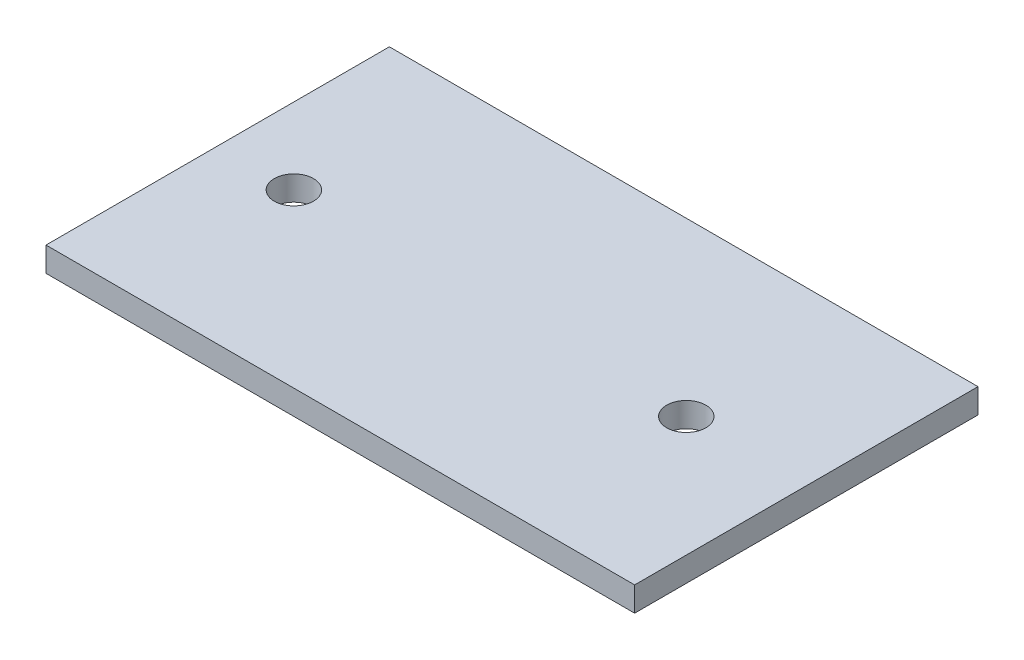
ISO-10303-21;
HEADER;
FILE_DESCRIPTION(('STEP AP214'),'2;1');
FILE_NAME('part.step','',(''),(''),'','','');
FILE_SCHEMA(('AUTOMOTIVE_DESIGN { 1 0 10303 214 1 1 1 1 }'));
ENDSEC;
DATA;
#1=APPLICATION_CONTEXT('core data for automotive mechanical design processes');
#2=APPLICATION_PROTOCOL_DEFINITION('international standard','automotive_design',2000,#1);
#3=PRODUCT_CONTEXT('',#1,'mechanical');
#4=PRODUCT('Part','Part','',(#3));
#5=PRODUCT_RELATED_PRODUCT_CATEGORY('part','',(#4));
#6=PRODUCT_DEFINITION_FORMATION('','',#4);
#7=PRODUCT_DEFINITION_CONTEXT('part definition',#1,'design');
#8=PRODUCT_DEFINITION('design','',#6,#7);
#9=PRODUCT_DEFINITION_SHAPE('','',#8);
#10=(LENGTH_UNIT() NAMED_UNIT(*) SI_UNIT(.MILLI.,.METRE.));
#11=(NAMED_UNIT(*) PLANE_ANGLE_UNIT() SI_UNIT($,.RADIAN.));
#12=(NAMED_UNIT(*) SI_UNIT($,.STERADIAN.) SOLID_ANGLE_UNIT());
#13=UNCERTAINTY_MEASURE_WITH_UNIT(LENGTH_MEASURE(1.E-05),#10,'distance_accuracy_value','');
#14=(GEOMETRIC_REPRESENTATION_CONTEXT(3) GLOBAL_UNCERTAINTY_ASSIGNED_CONTEXT((#13)) GLOBAL_UNIT_ASSIGNED_CONTEXT((#10,
#11,#12)) REPRESENTATION_CONTEXT('',''));
#15=CARTESIAN_POINT('',(0.,0.,0.));
#16=DIRECTION('',(0.,0.,1.));
#17=DIRECTION('',(1.,0.,0.));
#18=AXIS2_PLACEMENT_3D('',#15,#16,#17);
#19=CARTESIAN_POINT('',(0.,5.,0.));
#20=DIRECTION('',(0.,1.,0.));
#21=DIRECTION('',(0.,0.,1.));
#22=AXIS2_PLACEMENT_3D('',#19,#20,#21);
#23=PLANE('',#22);
#24=CARTESIAN_POINT('',(0.,5.,30.0341049386259));
#25=DIRECTION('',(0.,1.,0.));
#26=DIRECTION('',(0.,0.,1.));
#27=AXIS2_PLACEMENT_3D('',#24,#25,#26);
#28=CIRCLE('',#27,4.);
#29=CARTESIAN_POINT('',(0.,5.,34.0341049386259));
#30=VERTEX_POINT('',#29);
#31=EDGE_CURVE('E100',#30,#30,#28,.T.);
#32=ORIENTED_EDGE('',*,*,#31,.F.);
#33=EDGE_LOOP('',(#32));
#34=FACE_BOUND('',#33,.T.);
#35=DIRECTION('',(0.,0.,1.));
#36=VECTOR('',#35,1.);
#37=CARTESIAN_POINT('',(-15.5286393255011,5.,-4.96589506137411));
#38=LINE('',#37,#36);
#39=CARTESIAN_POINT('',(-15.5286393255011,5.,-4.96589506137411));
#40=VERTEX_POINT('',#39);
#41=CARTESIAN_POINT('',(-15.5286393255011,5.,65.0341049386259));
#42=VERTEX_POINT('',#41);
#43=EDGE_CURVE('E85',#40,#42,#38,.T.);
#44=ORIENTED_EDGE('',*,*,#43,.T.);
#45=DIRECTION('',(1.,0.,0.));
#46=VECTOR('',#45,1.);
#47=CARTESIAN_POINT('',(-15.5286393255011,5.,65.0341049386259));
#48=LINE('',#47,#46);
#49=CARTESIAN_POINT('',(104.471360674499,5.,65.0341049386259));
#50=VERTEX_POINT('',#49);
#51=EDGE_CURVE('E80',#42,#50,#48,.T.);
#52=ORIENTED_EDGE('',*,*,#51,.T.);
#53=DIRECTION('',(0.,0.,-1.));
#54=VECTOR('',#53,1.);
#55=CARTESIAN_POINT('',(104.471360674499,5.,-4.96589506137411));
#56=LINE('',#55,#54);
#57=CARTESIAN_POINT('',(104.471360674499,5.,-4.96589506137411));
#58=VERTEX_POINT('',#57);
#59=EDGE_CURVE('E83',#50,#58,#56,.T.);
#60=ORIENTED_EDGE('',*,*,#59,.T.);
#61=DIRECTION('',(-1.,0.,0.));
#62=VECTOR('',#61,1.);
#63=CARTESIAN_POINT('',(-15.5286393255011,5.,-4.96589506137411));
#64=LINE('',#63,#62);
#65=EDGE_CURVE('E50',#58,#40,#64,.T.);
#66=ORIENTED_EDGE('',*,*,#65,.T.);
#67=EDGE_LOOP('',(#44,#52,#60,#66));
#68=FACE_BOUND('',#67,.T.);
#69=CARTESIAN_POINT('',(80.,5.,30.0341049386259));
#70=DIRECTION('',(0.,1.,0.));
#71=DIRECTION('',(0.,0.,1.));
#72=AXIS2_PLACEMENT_3D('',#69,#70,#71);
#73=CIRCLE('',#72,4.00000000000001);
#74=CARTESIAN_POINT('',(80.,5.,34.0341049386259));
#75=VERTEX_POINT('',#74);
#76=EDGE_CURVE('E115',#75,#75,#73,.T.);
#77=ORIENTED_EDGE('',*,*,#76,.F.);
#78=EDGE_LOOP('',(#77));
#79=FACE_BOUND('',#78,.T.);
#80=ADVANCED_FACE('F33',(#34,#68,#79),#23,.T.);
#81=CARTESIAN_POINT('',(0.,0.,0.));
#82=DIRECTION('',(0.,1.,0.));
#83=DIRECTION('',(0.,0.,1.));
#84=AXIS2_PLACEMENT_3D('',#81,#82,#83);
#85=PLANE('',#84);
#86=DIRECTION('',(0.,0.,1.));
#87=VECTOR('',#86,1.);
#88=CARTESIAN_POINT('',(-15.5286393255011,0.,-4.96589506137411));
#89=LINE('',#88,#87);
#90=CARTESIAN_POINT('',(-15.5286393255011,0.,-4.96589506137411));
#91=VERTEX_POINT('',#90);
#92=CARTESIAN_POINT('',(-15.5286393255011,0.,65.0341049386259));
#93=VERTEX_POINT('',#92);
#94=EDGE_CURVE('E97',#91,#93,#89,.T.);
#95=ORIENTED_EDGE('',*,*,#94,.F.);
#96=DIRECTION('',(-1.,0.,0.));
#97=VECTOR('',#96,1.);
#98=CARTESIAN_POINT('',(-15.5286393255011,0.,-4.96589506137411));
#99=LINE('',#98,#97);
#100=CARTESIAN_POINT('',(104.471360674499,0.,-4.96589506137411));
#101=VERTEX_POINT('',#100);
#102=EDGE_CURVE('E73',#101,#91,#99,.T.);
#103=ORIENTED_EDGE('',*,*,#102,.F.);
#104=DIRECTION('',(0.,0.,-1.));
#105=VECTOR('',#104,1.);
#106=CARTESIAN_POINT('',(104.471360674499,0.,-4.96589506137411));
#107=LINE('',#106,#105);
#108=CARTESIAN_POINT('',(104.471360674499,0.,65.0341049386259));
#109=VERTEX_POINT('',#108);
#110=EDGE_CURVE('E67',#109,#101,#107,.T.);
#111=ORIENTED_EDGE('',*,*,#110,.F.);
#112=DIRECTION('',(1.,0.,0.));
#113=VECTOR('',#112,1.);
#114=CARTESIAN_POINT('',(-15.5286393255011,0.,65.0341049386259));
#115=LINE('',#114,#113);
#116=EDGE_CURVE('E89',#93,#109,#115,.T.);
#117=ORIENTED_EDGE('',*,*,#116,.F.);
#118=EDGE_LOOP('',(#95,#103,#111,#117));
#119=FACE_BOUND('',#118,.T.);
#120=CARTESIAN_POINT('',(0.,0.,30.0341049386259));
#121=DIRECTION('',(0.,1.,0.));
#122=DIRECTION('',(0.,0.,1.));
#123=AXIS2_PLACEMENT_3D('',#120,#121,#122);
#124=CIRCLE('',#123,4.);
#125=CARTESIAN_POINT('',(0.,0.,34.0341049386259));
#126=VERTEX_POINT('',#125);
#127=EDGE_CURVE('E112',#126,#126,#124,.T.);
#128=ORIENTED_EDGE('',*,*,#127,.T.);
#129=EDGE_LOOP('',(#128));
#130=FACE_BOUND('',#129,.T.);
#131=CARTESIAN_POINT('',(80.,0.,30.0341049386259));
#132=DIRECTION('',(0.,1.,0.));
#133=DIRECTION('',(0.,0.,1.));
#134=AXIS2_PLACEMENT_3D('',#131,#132,#133);
#135=CIRCLE('',#134,4.00000000000001);
#136=CARTESIAN_POINT('',(80.,0.,34.0341049386259));
#137=VERTEX_POINT('',#136);
#138=EDGE_CURVE('E118',#137,#137,#135,.T.);
#139=ORIENTED_EDGE('',*,*,#138,.T.);
#140=EDGE_LOOP('',(#139));
#141=FACE_BOUND('',#140,.T.);
#142=ADVANCED_FACE('F108',(#119,#130,#141),#85,.F.);
#143=CARTESIAN_POINT('',(-15.5286393255011,5.,-4.96589506137411));
#144=DIRECTION('',(1.,0.,0.));
#145=DIRECTION('',(0.,0.,-1.));
#146=AXIS2_PLACEMENT_3D('',#143,#144,#145);
#147=PLANE('',#146);
#148=ORIENTED_EDGE('',*,*,#94,.T.);
#149=DIRECTION('',(0.,-1.,0.));
#150=VECTOR('',#149,1.);
#151=CARTESIAN_POINT('',(-15.5286393255011,5.,65.0341049386259));
#152=LINE('',#151,#150);
#153=EDGE_CURVE('E11',#42,#93,#152,.T.);
#154=ORIENTED_EDGE('',*,*,#153,.F.);
#155=ORIENTED_EDGE('',*,*,#43,.F.);
#156=DIRECTION('',(0.,-1.,0.));
#157=VECTOR('',#156,1.);
#158=CARTESIAN_POINT('',(-15.5286393255011,5.,-4.96589506137411));
#159=LINE('',#158,#157);
#160=EDGE_CURVE('E93',#40,#91,#159,.T.);
#161=ORIENTED_EDGE('',*,*,#160,.T.);
#162=EDGE_LOOP('',(#148,#154,#155,#161));
#163=FACE_BOUND('',#162,.T.);
#164=ADVANCED_FACE('F35',(#163),#147,.F.);
#165=CARTESIAN_POINT('',(-15.5286393255011,5.,65.0341049386259));
#166=DIRECTION('',(0.,0.,-1.));
#167=DIRECTION('',(-1.,0.,0.));
#168=AXIS2_PLACEMENT_3D('',#165,#166,#167);
#169=PLANE('',#168);
#170=ORIENTED_EDGE('',*,*,#116,.T.);
#171=DIRECTION('',(0.,-1.,0.));
#172=VECTOR('',#171,1.);
#173=CARTESIAN_POINT('',(104.471360674499,5.,65.0341049386259));
#174=LINE('',#173,#172);
#175=EDGE_CURVE('E42',#50,#109,#174,.T.);
#176=ORIENTED_EDGE('',*,*,#175,.F.);
#177=ORIENTED_EDGE('',*,*,#51,.F.);
#178=ORIENTED_EDGE('',*,*,#153,.T.);
#179=EDGE_LOOP('',(#170,#176,#177,#178));
#180=FACE_BOUND('',#179,.T.);
#181=ADVANCED_FACE('F88',(#180),#169,.F.);
#182=CARTESIAN_POINT('',(104.471360674499,5.,-4.96589506137411));
#183=DIRECTION('',(-1.,0.,0.));
#184=DIRECTION('',(0.,0.,1.));
#185=AXIS2_PLACEMENT_3D('',#182,#183,#184);
#186=PLANE('',#185);
#187=ORIENTED_EDGE('',*,*,#110,.T.);
#188=DIRECTION('',(0.,-1.,0.));
#189=VECTOR('',#188,1.);
#190=CARTESIAN_POINT('',(104.471360674499,5.,-4.96589506137411));
#191=LINE('',#190,#189);
#192=EDGE_CURVE('E90',#58,#101,#191,.T.);
#193=ORIENTED_EDGE('',*,*,#192,.F.);
#194=ORIENTED_EDGE('',*,*,#59,.F.);
#195=ORIENTED_EDGE('',*,*,#175,.T.);
#196=EDGE_LOOP('',(#187,#193,#194,#195));
#197=FACE_BOUND('',#196,.T.);
#198=ADVANCED_FACE('F91',(#197),#186,.F.);
#199=CARTESIAN_POINT('',(-15.5286393255011,5.,-4.96589506137411));
#200=DIRECTION('',(0.,0.,1.));
#201=DIRECTION('',(1.,0.,0.));
#202=AXIS2_PLACEMENT_3D('',#199,#200,#201);
#203=PLANE('',#202);
#204=ORIENTED_EDGE('',*,*,#102,.T.);
#205=ORIENTED_EDGE('',*,*,#160,.F.);
#206=ORIENTED_EDGE('',*,*,#65,.F.);
#207=ORIENTED_EDGE('',*,*,#192,.T.);
#208=EDGE_LOOP('',(#204,#205,#206,#207));
#209=FACE_BOUND('',#208,.T.);
#210=ADVANCED_FACE('F105',(#209),#203,.F.);
#211=CARTESIAN_POINT('',(0.,5.,30.0341049386259));
#212=DIRECTION('',(0.,-1.,0.));
#213=DIRECTION('',(0.,0.,-1.));
#214=AXIS2_PLACEMENT_3D('',#211,#212,#213);
#215=CYLINDRICAL_SURFACE('',#214,4.);
#216=ORIENTED_EDGE('',*,*,#31,.T.);
#217=EDGE_LOOP('',(#216));
#218=FACE_BOUND('',#217,.T.);
#219=ORIENTED_EDGE('',*,*,#127,.F.);
#220=EDGE_LOOP('',(#219));
#221=FACE_BOUND('',#220,.T.);
#222=ADVANCED_FACE('F135',(#218,#221),#215,.F.);
#223=CARTESIAN_POINT('',(80.,5.,30.0341049386259));
#224=DIRECTION('',(0.,-1.,0.));
#225=DIRECTION('',(0.,0.,-1.));
#226=AXIS2_PLACEMENT_3D('',#223,#224,#225);
#227=CYLINDRICAL_SURFACE('',#226,4.00000000000001);
#228=ORIENTED_EDGE('',*,*,#76,.T.);
#229=EDGE_LOOP('',(#228));
#230=FACE_BOUND('',#229,.T.);
#231=ORIENTED_EDGE('',*,*,#138,.F.);
#232=EDGE_LOOP('',(#231));
#233=FACE_BOUND('',#232,.T.);
#234=ADVANCED_FACE('F124',(#230,#233),#227,.F.);
#235=CLOSED_SHELL('',(#80,#142,#164,#181,#198,#210,#222,#234));
#236=MANIFOLD_SOLID_BREP('B2',#235);
#237=ADVANCED_BREP_SHAPE_REPRESENTATION('',(#18,#236),#14);
#238=SHAPE_DEFINITION_REPRESENTATION(#9,#237);
ENDSEC;
END-ISO-10303-21;
